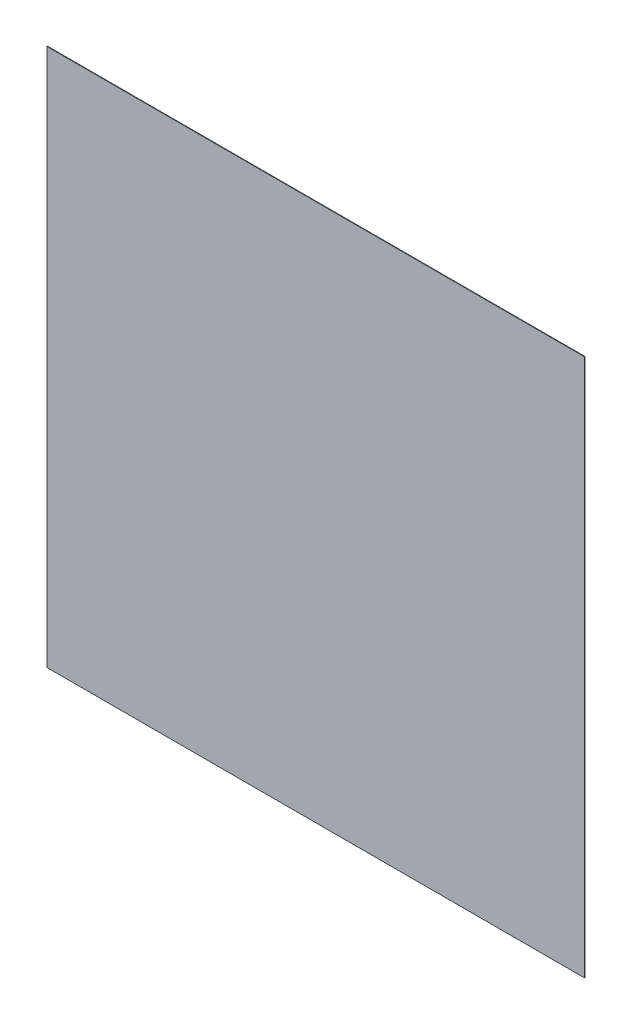
ISO-10303-21;
HEADER;
FILE_DESCRIPTION(('STEP AP214'),'2;1');
FILE_NAME('part.step','',(''),(''),'','','');
FILE_SCHEMA(('AUTOMOTIVE_DESIGN { 1 0 10303 214 1 1 1 1 }'));
ENDSEC;
DATA;
#1=APPLICATION_CONTEXT('core data for automotive mechanical design processes');
#2=APPLICATION_PROTOCOL_DEFINITION('international standard','automotive_design',2000,#1);
#3=PRODUCT_CONTEXT('',#1,'mechanical');
#4=PRODUCT('Part','Part','',(#3));
#5=PRODUCT_RELATED_PRODUCT_CATEGORY('part','',(#4));
#6=PRODUCT_DEFINITION_FORMATION('','',#4);
#7=PRODUCT_DEFINITION_CONTEXT('part definition',#1,'design');
#8=PRODUCT_DEFINITION('design','',#6,#7);
#9=PRODUCT_DEFINITION_SHAPE('','',#8);
#10=(LENGTH_UNIT() NAMED_UNIT(*) SI_UNIT(.MILLI.,.METRE.));
#11=(NAMED_UNIT(*) PLANE_ANGLE_UNIT() SI_UNIT($,.RADIAN.));
#12=(NAMED_UNIT(*) SI_UNIT($,.STERADIAN.) SOLID_ANGLE_UNIT());
#13=UNCERTAINTY_MEASURE_WITH_UNIT(LENGTH_MEASURE(1.E-05),#10,'distance_accuracy_value','');
#14=(GEOMETRIC_REPRESENTATION_CONTEXT(3) GLOBAL_UNCERTAINTY_ASSIGNED_CONTEXT((#13)) GLOBAL_UNIT_ASSIGNED_CONTEXT((#10,
#11,#12)) REPRESENTATION_CONTEXT('',''));
#15=CARTESIAN_POINT('',(0.,0.,0.));
#16=DIRECTION('',(0.,0.,1.));
#17=DIRECTION('',(1.,0.,0.));
#18=AXIS2_PLACEMENT_3D('',#15,#16,#17);
#19=CARTESIAN_POINT('',(1270.,1270.,2.54));
#20=DIRECTION('',(0.,-1.,0.));
#21=DIRECTION('',(0.,0.,-1.));
#22=AXIS2_PLACEMENT_3D('',#19,#20,#21);
#23=PLANE('',#22);
#24=DIRECTION('',(-1.,0.,0.));
#25=VECTOR('',#24,1.);
#26=CARTESIAN_POINT('',(1270.,1270.,0.));
#27=LINE('',#26,#25);
#28=CARTESIAN_POINT('',(1270.,1270.,0.));
#29=VERTEX_POINT('',#28);
#30=CARTESIAN_POINT('',(-1270.,1270.,0.));
#31=VERTEX_POINT('',#30);
#32=EDGE_CURVE('E113',#29,#31,#27,.T.);
#33=ORIENTED_EDGE('',*,*,#32,.T.);
#34=DIRECTION('',(0.,0.,-1.));
#35=VECTOR('',#34,1.);
#36=CARTESIAN_POINT('',(-1270.,1270.,2.54));
#37=LINE('',#36,#35);
#38=CARTESIAN_POINT('',(-1270.,1270.,2.54));
#39=VERTEX_POINT('',#38);
#40=EDGE_CURVE('E11',#39,#31,#37,.T.);
#41=ORIENTED_EDGE('',*,*,#40,.F.);
#42=DIRECTION('',(-1.,0.,0.));
#43=VECTOR('',#42,1.);
#44=CARTESIAN_POINT('',(1270.,1270.,2.54));
#45=LINE('',#44,#43);
#46=CARTESIAN_POINT('',(1270.,1270.,2.54));
#47=VERTEX_POINT('',#46);
#48=EDGE_CURVE('E97',#47,#39,#45,.T.);
#49=ORIENTED_EDGE('',*,*,#48,.F.);
#50=DIRECTION('',(0.,0.,-1.));
#51=VECTOR('',#50,1.);
#52=CARTESIAN_POINT('',(1270.,1270.,2.54));
#53=LINE('',#52,#51);
#54=EDGE_CURVE('E109',#47,#29,#53,.T.);
#55=ORIENTED_EDGE('',*,*,#54,.T.);
#56=EDGE_LOOP('',(#33,#41,#49,#55));
#57=FACE_BOUND('',#56,.T.);
#58=ADVANCED_FACE('F45',(#57),#23,.F.);
#59=CARTESIAN_POINT('',(-1270.,-1270.,2.54));
#60=DIRECTION('',(1.,0.,0.));
#61=DIRECTION('',(0.,0.,-1.));
#62=AXIS2_PLACEMENT_3D('',#59,#60,#61);
#63=PLANE('',#62);
#64=DIRECTION('',(0.,-1.,0.));
#65=VECTOR('',#64,1.);
#66=CARTESIAN_POINT('',(-1270.,-1270.,0.));
#67=LINE('',#66,#65);
#68=CARTESIAN_POINT('',(-1270.,-1270.,0.));
#69=VERTEX_POINT('',#68);
#70=EDGE_CURVE('E102',#31,#69,#67,.T.);
#71=ORIENTED_EDGE('',*,*,#70,.T.);
#72=DIRECTION('',(0.,0.,-1.));
#73=VECTOR('',#72,1.);
#74=CARTESIAN_POINT('',(-1270.,-1270.,2.54));
#75=LINE('',#74,#73);
#76=CARTESIAN_POINT('',(-1270.,-1270.,2.54));
#77=VERTEX_POINT('',#76);
#78=EDGE_CURVE('E54',#77,#69,#75,.T.);
#79=ORIENTED_EDGE('',*,*,#78,.F.);
#80=DIRECTION('',(0.,-1.,0.));
#81=VECTOR('',#80,1.);
#82=CARTESIAN_POINT('',(-1270.,-1270.,2.54));
#83=LINE('',#82,#81);
#84=EDGE_CURVE('E92',#39,#77,#83,.T.);
#85=ORIENTED_EDGE('',*,*,#84,.F.);
#86=ORIENTED_EDGE('',*,*,#40,.T.);
#87=EDGE_LOOP('',(#71,#79,#85,#86));
#88=FACE_BOUND('',#87,.T.);
#89=ADVANCED_FACE('F101',(#88),#63,.F.);
#90=CARTESIAN_POINT('',(1270.,-1270.,2.54));
#91=DIRECTION('',(0.,1.,0.));
#92=DIRECTION('',(0.,0.,1.));
#93=AXIS2_PLACEMENT_3D('',#90,#91,#92);
#94=PLANE('',#93);
#95=DIRECTION('',(1.,0.,0.));
#96=VECTOR('',#95,1.);
#97=CARTESIAN_POINT('',(1270.,-1270.,0.));
#98=LINE('',#97,#96);
#99=CARTESIAN_POINT('',(1270.,-1270.,0.));
#100=VERTEX_POINT('',#99);
#101=EDGE_CURVE('E79',#69,#100,#98,.T.);
#102=ORIENTED_EDGE('',*,*,#101,.T.);
#103=DIRECTION('',(0.,0.,-1.));
#104=VECTOR('',#103,1.);
#105=CARTESIAN_POINT('',(1270.,-1270.,2.54));
#106=LINE('',#105,#104);
#107=CARTESIAN_POINT('',(1270.,-1270.,2.54));
#108=VERTEX_POINT('',#107);
#109=EDGE_CURVE('E104',#108,#100,#106,.T.);
#110=ORIENTED_EDGE('',*,*,#109,.F.);
#111=DIRECTION('',(1.,0.,0.));
#112=VECTOR('',#111,1.);
#113=CARTESIAN_POINT('',(1270.,-1270.,2.54));
#114=LINE('',#113,#112);
#115=EDGE_CURVE('E95',#77,#108,#114,.T.);
#116=ORIENTED_EDGE('',*,*,#115,.F.);
#117=ORIENTED_EDGE('',*,*,#78,.T.);
#118=EDGE_LOOP('',(#102,#110,#116,#117));
#119=FACE_BOUND('',#118,.T.);
#120=ADVANCED_FACE('F105',(#119),#94,.F.);
#121=CARTESIAN_POINT('',(1270.,-1270.,2.54));
#122=DIRECTION('',(-1.,0.,0.));
#123=DIRECTION('',(0.,0.,1.));
#124=AXIS2_PLACEMENT_3D('',#121,#122,#123);
#125=PLANE('',#124);
#126=DIRECTION('',(0.,1.,0.));
#127=VECTOR('',#126,1.);
#128=CARTESIAN_POINT('',(1270.,-1270.,0.));
#129=LINE('',#128,#127);
#130=EDGE_CURVE('E85',#100,#29,#129,.T.);
#131=ORIENTED_EDGE('',*,*,#130,.T.);
#132=ORIENTED_EDGE('',*,*,#54,.F.);
#133=DIRECTION('',(0.,1.,0.));
#134=VECTOR('',#133,1.);
#135=CARTESIAN_POINT('',(1270.,-1270.,2.54));
#136=LINE('',#135,#134);
#137=EDGE_CURVE('E62',#108,#47,#136,.T.);
#138=ORIENTED_EDGE('',*,*,#137,.F.);
#139=ORIENTED_EDGE('',*,*,#109,.T.);
#140=EDGE_LOOP('',(#131,#132,#138,#139));
#141=FACE_BOUND('',#140,.T.);
#142=ADVANCED_FACE('F126',(#141),#125,.F.);
#143=CARTESIAN_POINT('',(0.,0.,2.54));
#144=DIRECTION('',(0.,0.,-1.));
#145=DIRECTION('',(-1.,0.,0.));
#146=AXIS2_PLACEMENT_3D('',#143,#144,#145);
#147=PLANE('',#146);
#148=ORIENTED_EDGE('',*,*,#48,.T.);
#149=ORIENTED_EDGE('',*,*,#84,.T.);
#150=ORIENTED_EDGE('',*,*,#115,.T.);
#151=ORIENTED_EDGE('',*,*,#137,.T.);
#152=EDGE_LOOP('',(#148,#149,#150,#151));
#153=FACE_BOUND('',#152,.T.);
#154=ADVANCED_FACE('F93',(#153),#147,.F.);
#155=CARTESIAN_POINT('',(0.,0.,0.));
#156=DIRECTION('',(0.,0.,-1.));
#157=DIRECTION('',(-1.,0.,0.));
#158=AXIS2_PLACEMENT_3D('',#155,#156,#157);
#159=PLANE('',#158);
#160=ORIENTED_EDGE('',*,*,#32,.F.);
#161=ORIENTED_EDGE('',*,*,#130,.F.);
#162=ORIENTED_EDGE('',*,*,#101,.F.);
#163=ORIENTED_EDGE('',*,*,#70,.F.);
#164=EDGE_LOOP('',(#160,#161,#162,#163));
#165=FACE_BOUND('',#164,.T.);
#166=ADVANCED_FACE('F129',(#165),#159,.T.);
#167=CLOSED_SHELL('',(#58,#89,#120,#142,#154,#166));
#168=MANIFOLD_SOLID_BREP('B2',#167);
#169=ADVANCED_BREP_SHAPE_REPRESENTATION('',(#18,#168),#14);
#170=SHAPE_DEFINITION_REPRESENTATION(#9,#169);
ENDSEC;
END-ISO-10303-21;
